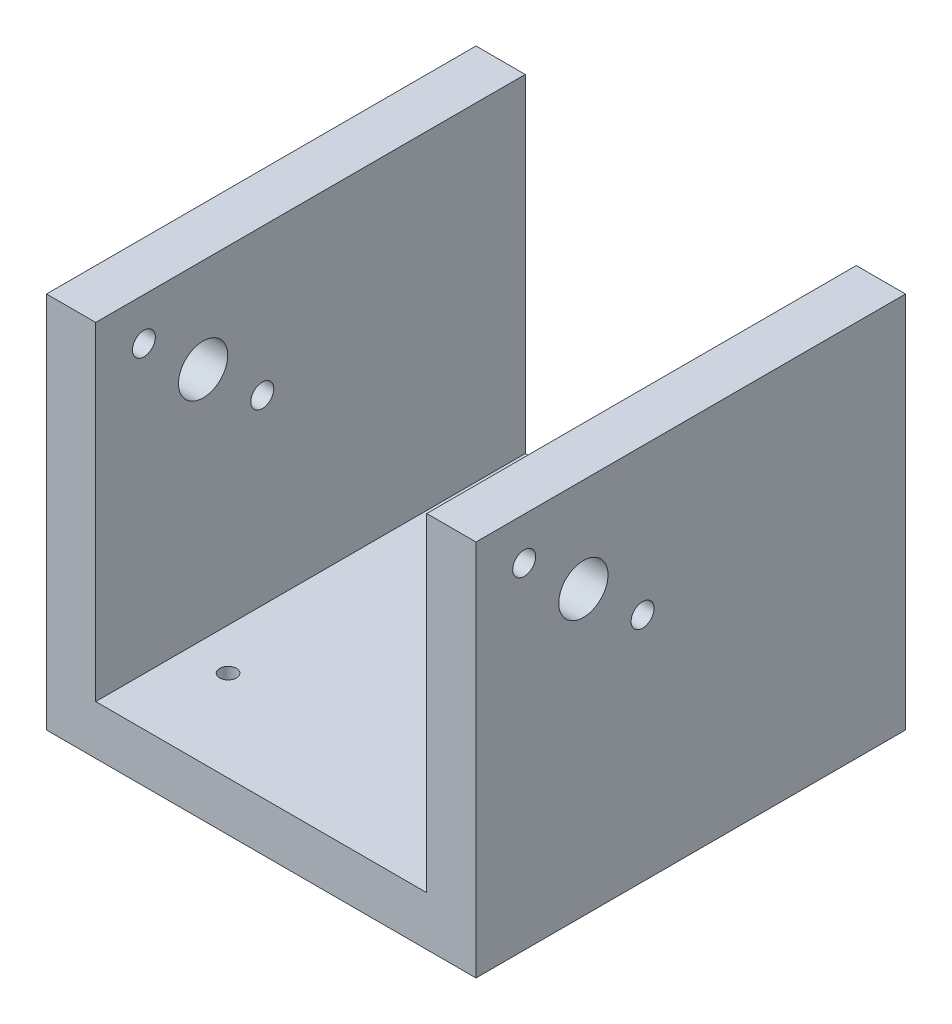
ISO-10303-21;
HEADER;
FILE_DESCRIPTION(('STEP AP214'),'2;1');
FILE_NAME('part.step','',(''),(''),'','','');
FILE_SCHEMA(('AUTOMOTIVE_DESIGN { 1 0 10303 214 1 1 1 1 }'));
ENDSEC;
DATA;
#1=APPLICATION_CONTEXT('core data for automotive mechanical design processes');
#2=APPLICATION_PROTOCOL_DEFINITION('international standard','automotive_design',2000,#1);
#3=PRODUCT_CONTEXT('',#1,'mechanical');
#4=PRODUCT('Part','Part','',(#3));
#5=PRODUCT_RELATED_PRODUCT_CATEGORY('part','',(#4));
#6=PRODUCT_DEFINITION_FORMATION('','',#4);
#7=PRODUCT_DEFINITION_CONTEXT('part definition',#1,'design');
#8=PRODUCT_DEFINITION('design','',#6,#7);
#9=PRODUCT_DEFINITION_SHAPE('','',#8);
#10=(LENGTH_UNIT() NAMED_UNIT(*) SI_UNIT(.MILLI.,.METRE.));
#11=(NAMED_UNIT(*) PLANE_ANGLE_UNIT() SI_UNIT($,.RADIAN.));
#12=(NAMED_UNIT(*) SI_UNIT($,.STERADIAN.) SOLID_ANGLE_UNIT());
#13=UNCERTAINTY_MEASURE_WITH_UNIT(LENGTH_MEASURE(1.E-05),#10,'distance_accuracy_value','');
#14=(GEOMETRIC_REPRESENTATION_CONTEXT(3) GLOBAL_UNCERTAINTY_ASSIGNED_CONTEXT((#13)) GLOBAL_UNIT_ASSIGNED_CONTEXT((#10,
#11,#12)) REPRESENTATION_CONTEXT('',''));
#15=CARTESIAN_POINT('',(0.,0.,0.));
#16=DIRECTION('',(0.,0.,1.));
#17=DIRECTION('',(1.,0.,0.));
#18=AXIS2_PLACEMENT_3D('',#15,#16,#17);
#19=CARTESIAN_POINT('',(0.,15.,0.));
#20=DIRECTION('',(0.,1.,0.));
#21=DIRECTION('',(0.,0.,1.));
#22=AXIS2_PLACEMENT_3D('',#19,#20,#21);
#23=PLANE('',#22);
#24=DIRECTION('',(0.,0.,1.));
#25=VECTOR('',#24,1.);
#26=CARTESIAN_POINT('',(-50.4073772597556,15.,0.));
#27=LINE('',#26,#25);
#28=CARTESIAN_POINT('',(-50.4073772597556,15.,-65.4073772597556));
#29=VERTEX_POINT('',#28);
#30=CARTESIAN_POINT('',(-50.4073772597556,15.,65.4073772597556));
#31=VERTEX_POINT('',#30);
#32=EDGE_CURVE('E117',#29,#31,#27,.T.);
#33=ORIENTED_EDGE('',*,*,#32,.T.);
#34=DIRECTION('',(1.,0.,0.));
#35=VECTOR('',#34,1.);
#36=CARTESIAN_POINT('',(65.4073772597556,15.,65.4073772597556));
#37=LINE('',#36,#35);
#38=CARTESIAN_POINT('',(50.4073772597556,15.,65.4073772597556));
#39=VERTEX_POINT('',#38);
#40=EDGE_CURVE('E186',#31,#39,#37,.T.);
#41=ORIENTED_EDGE('',*,*,#40,.T.);
#42=DIRECTION('',(0.,0.,-1.));
#43=VECTOR('',#42,1.);
#44=CARTESIAN_POINT('',(50.4073772597556,15.,0.));
#45=LINE('',#44,#43);
#46=CARTESIAN_POINT('',(50.4073772597556,15.,-65.4073772597556));
#47=VERTEX_POINT('',#46);
#48=EDGE_CURVE('E119',#39,#47,#45,.T.);
#49=ORIENTED_EDGE('',*,*,#48,.T.);
#50=DIRECTION('',(-1.,0.,0.));
#51=VECTOR('',#50,1.);
#52=CARTESIAN_POINT('',(35.4073772597556,15.,-65.4073772597556));
#53=LINE('',#52,#51);
#54=EDGE_CURVE('E58',#47,#29,#53,.T.);
#55=ORIENTED_EDGE('',*,*,#54,.T.);
#56=EDGE_LOOP('',(#33,#41,#49,#55));
#57=FACE_BOUND('',#56,.T.);
#58=CARTESIAN_POINT('',(-37.7595021153596,15.,37.7595021153637));
#59=DIRECTION('',(0.,1.,0.));
#60=DIRECTION('',(0.,0.,1.));
#61=AXIS2_PLACEMENT_3D('',#58,#59,#60);
#62=CIRCLE('',#61,2.55000000000154);
#63=CARTESIAN_POINT('',(-37.7595021153596,15.,40.3095021153653));
#64=VERTEX_POINT('',#63);
#65=EDGE_CURVE('E168',#64,#64,#62,.T.);
#66=ORIENTED_EDGE('',*,*,#65,.F.);
#67=EDGE_LOOP('',(#66));
#68=FACE_BOUND('',#67,.T.);
#69=CARTESIAN_POINT('',(37.7595021153616,15.,-37.7595021153616));
#70=DIRECTION('',(0.,1.,0.));
#71=DIRECTION('',(0.,0.,1.));
#72=AXIS2_PLACEMENT_3D('',#69,#70,#71);
#73=CIRCLE('',#72,2.55);
#74=CARTESIAN_POINT('',(37.7595021153616,15.,-35.2095021153616));
#75=VERTEX_POINT('',#74);
#76=EDGE_CURVE('E180',#75,#75,#73,.T.);
#77=ORIENTED_EDGE('',*,*,#76,.F.);
#78=EDGE_LOOP('',(#77));
#79=FACE_BOUND('',#78,.T.);
#80=CARTESIAN_POINT('',(37.7595021153637,15.,37.7595021153616));
#81=DIRECTION('',(0.,1.,0.));
#82=DIRECTION('',(0.,0.,1.));
#83=AXIS2_PLACEMENT_3D('',#80,#81,#82);
#84=CIRCLE('',#83,2.54999999999946);
#85=CARTESIAN_POINT('',(37.7595021153637,15.,40.3095021153611));
#86=VERTEX_POINT('',#85);
#87=EDGE_CURVE('E174',#86,#86,#84,.T.);
#88=ORIENTED_EDGE('',*,*,#87,.F.);
#89=EDGE_LOOP('',(#88));
#90=FACE_BOUND('',#89,.T.);
#91=CARTESIAN_POINT('',(-37.7595021153616,15.,-37.7595021153595));
#92=DIRECTION('',(0.,1.,0.));
#93=DIRECTION('',(0.,0.,1.));
#94=AXIS2_PLACEMENT_3D('',#91,#92,#93);
#95=CIRCLE('',#94,2.55000000000225);
#96=CARTESIAN_POINT('',(-37.7595021153616,15.,-35.2095021153573));
#97=VERTEX_POINT('',#96);
#98=EDGE_CURVE('E162',#97,#97,#95,.T.);
#99=ORIENTED_EDGE('',*,*,#98,.F.);
#100=EDGE_LOOP('',(#99));
#101=FACE_BOUND('',#100,.T.);
#102=ADVANCED_FACE('F41',(#57,#68,#79,#90,#101),#23,.T.);
#103=CARTESIAN_POINT('',(0.,0.,0.));
#104=DIRECTION('',(0.,1.,0.));
#105=DIRECTION('',(0.,0.,1.));
#106=AXIS2_PLACEMENT_3D('',#103,#104,#105);
#107=PLANE('',#106);
#108=DIRECTION('',(0.,0.,-1.));
#109=VECTOR('',#108,1.);
#110=CARTESIAN_POINT('',(65.4073772597556,0.,-65.4073772597556));
#111=LINE('',#110,#109);
#112=CARTESIAN_POINT('',(65.4073772597556,0.,65.4073772597556));
#113=VERTEX_POINT('',#112);
#114=CARTESIAN_POINT('',(65.4073772597556,0.,-65.4073772597556));
#115=VERTEX_POINT('',#114);
#116=EDGE_CURVE('E183',#113,#115,#111,.T.);
#117=ORIENTED_EDGE('',*,*,#116,.F.);
#118=DIRECTION('',(1.,0.,0.));
#119=VECTOR('',#118,1.);
#120=CARTESIAN_POINT('',(-35.4073772597556,0.,65.4073772597556));
#121=LINE('',#120,#119);
#122=CARTESIAN_POINT('',(-65.4073772597556,0.,65.4073772597556));
#123=VERTEX_POINT('',#122);
#124=EDGE_CURVE('E188',#123,#113,#121,.T.);
#125=ORIENTED_EDGE('',*,*,#124,.F.);
#126=DIRECTION('',(0.,0.,1.));
#127=VECTOR('',#126,1.);
#128=CARTESIAN_POINT('',(-65.4073772597557,0.,35.4073772597556));
#129=LINE('',#128,#127);
#130=CARTESIAN_POINT('',(-65.4073772597556,0.,-65.4073772597556));
#131=VERTEX_POINT('',#130);
#132=EDGE_CURVE('E195',#131,#123,#129,.T.);
#133=ORIENTED_EDGE('',*,*,#132,.F.);
#134=DIRECTION('',(-1.,0.,0.));
#135=VECTOR('',#134,1.);
#136=CARTESIAN_POINT('',(-65.4073772597556,0.,-65.4073772597556));
#137=LINE('',#136,#135);
#138=EDGE_CURVE('E193',#115,#131,#137,.T.);
#139=ORIENTED_EDGE('',*,*,#138,.F.);
#140=EDGE_LOOP('',(#117,#125,#133,#139));
#141=FACE_BOUND('',#140,.T.);
#142=CARTESIAN_POINT('',(37.7595021153616,0.,-37.7595021153616));
#143=DIRECTION('',(0.,1.,0.));
#144=DIRECTION('',(0.,0.,1.));
#145=AXIS2_PLACEMENT_3D('',#142,#143,#144);
#146=CIRCLE('',#145,2.55);
#147=CARTESIAN_POINT('',(37.7595021153616,0.,-35.2095021153616));
#148=VERTEX_POINT('',#147);
#149=EDGE_CURVE('E177',#148,#148,#146,.T.);
#150=ORIENTED_EDGE('',*,*,#149,.T.);
#151=EDGE_LOOP('',(#150));
#152=FACE_BOUND('',#151,.T.);
#153=CARTESIAN_POINT('',(37.7595021153637,0.,37.7595021153616));
#154=DIRECTION('',(0.,1.,0.));
#155=DIRECTION('',(0.,0.,1.));
#156=AXIS2_PLACEMENT_3D('',#153,#154,#155);
#157=CIRCLE('',#156,2.54999999999946);
#158=CARTESIAN_POINT('',(37.7595021153637,0.,40.3095021153611));
#159=VERTEX_POINT('',#158);
#160=EDGE_CURVE('E171',#159,#159,#157,.T.);
#161=ORIENTED_EDGE('',*,*,#160,.T.);
#162=EDGE_LOOP('',(#161));
#163=FACE_BOUND('',#162,.T.);
#164=CARTESIAN_POINT('',(-37.7595021153596,0.,37.7595021153637));
#165=DIRECTION('',(0.,1.,0.));
#166=DIRECTION('',(0.,0.,1.));
#167=AXIS2_PLACEMENT_3D('',#164,#165,#166);
#168=CIRCLE('',#167,2.55000000000154);
#169=CARTESIAN_POINT('',(-37.7595021153596,0.,40.3095021153653));
#170=VERTEX_POINT('',#169);
#171=EDGE_CURVE('E165',#170,#170,#168,.T.);
#172=ORIENTED_EDGE('',*,*,#171,.T.);
#173=EDGE_LOOP('',(#172));
#174=FACE_BOUND('',#173,.T.);
#175=CARTESIAN_POINT('',(-37.7595021153616,0.,-37.7595021153595));
#176=DIRECTION('',(0.,1.,0.));
#177=DIRECTION('',(0.,0.,1.));
#178=AXIS2_PLACEMENT_3D('',#175,#176,#177);
#179=CIRCLE('',#178,2.55000000000225);
#180=CARTESIAN_POINT('',(-37.7595021153616,0.,-35.2095021153573));
#181=VERTEX_POINT('',#180);
#182=EDGE_CURVE('E161',#181,#181,#179,.T.);
#183=ORIENTED_EDGE('',*,*,#182,.T.);
#184=EDGE_LOOP('',(#183));
#185=FACE_BOUND('',#184,.T.);
#186=ADVANCED_FACE('F253',(#141,#152,#163,#174,#185),#107,.F.);
#187=CARTESIAN_POINT('',(65.4073772597556,15.,-65.4073772597556));
#188=DIRECTION('',(-1.,0.,0.));
#189=DIRECTION('',(0.,0.,1.));
#190=AXIS2_PLACEMENT_3D('',#187,#188,#189);
#191=PLANE('',#190);
#192=CARTESIAN_POINT('',(65.4073772597556,102.095983063023,50.7288050169189));
#193=DIRECTION('',(-1.,0.,0.));
#194=DIRECTION('',(0.,0.,1.));
#195=AXIS2_PLACEMENT_3D('',#192,#193,#194);
#196=CIRCLE('',#195,3.5);
#197=CARTESIAN_POINT('',(65.4073772597556,102.095983063023,54.2288050169189));
#198=VERTEX_POINT('',#197);
#199=EDGE_CURVE('E226',#198,#198,#196,.F.);
#200=ORIENTED_EDGE('',*,*,#199,.F.);
#201=EDGE_LOOP('',(#200));
#202=FACE_BOUND('',#201,.T.);
#203=CARTESIAN_POINT('',(65.4073772597556,70.4040169369767,14.6785722428367));
#204=DIRECTION('',(-1.,0.,0.));
#205=DIRECTION('',(0.,0.,1.));
#206=AXIS2_PLACEMENT_3D('',#203,#204,#205);
#207=CIRCLE('',#206,3.5);
#208=CARTESIAN_POINT('',(65.4073772597556,70.4040169369767,18.1785722428367));
#209=VERTEX_POINT('',#208);
#210=EDGE_CURVE('E225',#209,#209,#207,.F.);
#211=ORIENTED_EDGE('',*,*,#210,.F.);
#212=EDGE_LOOP('',(#211));
#213=FACE_BOUND('',#212,.T.);
#214=CARTESIAN_POINT('',(65.4073772597556,86.25,32.7036886298778));
#215=DIRECTION('',(-1.,0.,0.));
#216=DIRECTION('',(0.,0.,1.));
#217=AXIS2_PLACEMENT_3D('',#214,#215,#216);
#218=CIRCLE('',#217,7.5);
#219=CARTESIAN_POINT('',(65.4073772597556,86.25,40.2036886298778));
#220=VERTEX_POINT('',#219);
#221=EDGE_CURVE('E208',#220,#220,#218,.F.);
#222=ORIENTED_EDGE('',*,*,#221,.F.);
#223=EDGE_LOOP('',(#222));
#224=FACE_BOUND('',#223,.T.);
#225=ORIENTED_EDGE('',*,*,#116,.T.);
#226=DIRECTION('',(0.,-1.,0.));
#227=VECTOR('',#226,1.);
#228=CARTESIAN_POINT('',(65.4073772597556,15.,-65.4073772597556));
#229=LINE('',#228,#227);
#230=CARTESIAN_POINT('',(65.4073772597556,115.,-65.4073772597556));
#231=VERTEX_POINT('',#230);
#232=EDGE_CURVE('E50',#231,#115,#229,.T.);
#233=ORIENTED_EDGE('',*,*,#232,.F.);
#234=DIRECTION('',(0.,0.,-1.));
#235=VECTOR('',#234,1.);
#236=CARTESIAN_POINT('',(65.4073772597556,115.,0.));
#237=LINE('',#236,#235);
#238=CARTESIAN_POINT('',(65.4073772597556,115.,65.4073772597556));
#239=VERTEX_POINT('',#238);
#240=EDGE_CURVE('E151',#239,#231,#237,.T.);
#241=ORIENTED_EDGE('',*,*,#240,.F.);
#242=DIRECTION('',(0.,-1.,0.));
#243=VECTOR('',#242,1.);
#244=CARTESIAN_POINT('',(65.4073772597556,15.,65.4073772597556));
#245=LINE('',#244,#243);
#246=EDGE_CURVE('E11',#239,#113,#245,.T.);
#247=ORIENTED_EDGE('',*,*,#246,.T.);
#248=EDGE_LOOP('',(#225,#233,#241,#247));
#249=FACE_BOUND('',#248,.T.);
#250=ADVANCED_FACE('F43',(#202,#213,#224,#249),#191,.F.);
#251=CARTESIAN_POINT('',(-65.4073772597556,15.,-65.4073772597556));
#252=DIRECTION('',(0.,0.,1.));
#253=DIRECTION('',(1.,0.,0.));
#254=AXIS2_PLACEMENT_3D('',#251,#252,#253);
#255=PLANE('',#254);
#256=ORIENTED_EDGE('',*,*,#138,.T.);
#257=DIRECTION('',(0.,-1.,0.));
#258=VECTOR('',#257,1.);
#259=CARTESIAN_POINT('',(-65.4073772597556,15.,-65.4073772597556));
#260=LINE('',#259,#258);
#261=CARTESIAN_POINT('',(-65.4073772597556,115.,-65.4073772597556));
#262=VERTEX_POINT('',#261);
#263=EDGE_CURVE('E127',#262,#131,#260,.T.);
#264=ORIENTED_EDGE('',*,*,#263,.F.);
#265=DIRECTION('',(-1.,0.,0.));
#266=VECTOR('',#265,1.);
#267=CARTESIAN_POINT('',(0.,115.,-65.4073772597556));
#268=LINE('',#267,#266);
#269=CARTESIAN_POINT('',(-50.4073772597556,115.,-65.4073772597556));
#270=VERTEX_POINT('',#269);
#271=EDGE_CURVE('E123',#270,#262,#268,.T.);
#272=ORIENTED_EDGE('',*,*,#271,.F.);
#273=DIRECTION('',(0.,-1.,0.));
#274=VECTOR('',#273,1.);
#275=CARTESIAN_POINT('',(-50.4073772597556,115.,-65.4073772597556));
#276=LINE('',#275,#274);
#277=EDGE_CURVE('E111',#270,#29,#276,.T.);
#278=ORIENTED_EDGE('',*,*,#277,.T.);
#279=ORIENTED_EDGE('',*,*,#54,.F.);
#280=DIRECTION('',(0.,-1.,0.));
#281=VECTOR('',#280,1.);
#282=CARTESIAN_POINT('',(50.4073772597556,115.,-65.4073772597556));
#283=LINE('',#282,#281);
#284=CARTESIAN_POINT('',(50.4073772597556,115.,-65.4073772597556));
#285=VERTEX_POINT('',#284);
#286=EDGE_CURVE('E66',#285,#47,#283,.T.);
#287=ORIENTED_EDGE('',*,*,#286,.F.);
#288=DIRECTION('',(-1.,0.,0.));
#289=VECTOR('',#288,1.);
#290=CARTESIAN_POINT('',(0.,115.,-65.4073772597556));
#291=LINE('',#290,#289);
#292=EDGE_CURVE('E154',#231,#285,#291,.T.);
#293=ORIENTED_EDGE('',*,*,#292,.F.);
#294=ORIENTED_EDGE('',*,*,#232,.T.);
#295=EDGE_LOOP('',(#256,#264,#272,#278,#279,#287,#293,#294));
#296=FACE_BOUND('',#295,.T.);
#297=ADVANCED_FACE('F125',(#296),#255,.F.);
#298=CARTESIAN_POINT('',(-65.4073772597557,15.,35.4073772597556));
#299=DIRECTION('',(1.,0.,0.));
#300=DIRECTION('',(0.,0.,-1.));
#301=AXIS2_PLACEMENT_3D('',#298,#299,#300);
#302=PLANE('',#301);
#303=CARTESIAN_POINT('',(-65.4073772597556,102.095983063023,50.7288050169189));
#304=DIRECTION('',(-1.,0.,0.));
#305=DIRECTION('',(0.,0.,1.));
#306=AXIS2_PLACEMENT_3D('',#303,#304,#305);
#307=CIRCLE('',#306,3.5);
#308=CARTESIAN_POINT('',(-65.4073772597556,102.095983063023,54.2288050169189));
#309=VERTEX_POINT('',#308);
#310=EDGE_CURVE('E230',#309,#309,#307,.T.);
#311=ORIENTED_EDGE('',*,*,#310,.F.);
#312=EDGE_LOOP('',(#311));
#313=FACE_BOUND('',#312,.T.);
#314=CARTESIAN_POINT('',(-65.4073772597557,70.4040169369767,14.6785722428367));
#315=DIRECTION('',(-1.,0.,0.));
#316=DIRECTION('',(0.,0.,1.));
#317=AXIS2_PLACEMENT_3D('',#314,#315,#316);
#318=CIRCLE('',#317,3.5);
#319=CARTESIAN_POINT('',(-65.4073772597557,70.4040169369767,18.1785722428367));
#320=VERTEX_POINT('',#319);
#321=EDGE_CURVE('E229',#320,#320,#318,.T.);
#322=ORIENTED_EDGE('',*,*,#321,.F.);
#323=EDGE_LOOP('',(#322));
#324=FACE_BOUND('',#323,.T.);
#325=CARTESIAN_POINT('',(-65.4073772597557,86.25,32.7036886298778));
#326=DIRECTION('',(-1.,0.,0.));
#327=DIRECTION('',(0.,0.,1.));
#328=AXIS2_PLACEMENT_3D('',#325,#326,#327);
#329=CIRCLE('',#328,7.5);
#330=CARTESIAN_POINT('',(-65.4073772597557,86.25,40.2036886298778));
#331=VERTEX_POINT('',#330);
#332=EDGE_CURVE('E222',#331,#331,#329,.T.);
#333=ORIENTED_EDGE('',*,*,#332,.F.);
#334=EDGE_LOOP('',(#333));
#335=FACE_BOUND('',#334,.T.);
#336=ORIENTED_EDGE('',*,*,#132,.T.);
#337=DIRECTION('',(0.,-1.,0.));
#338=VECTOR('',#337,1.);
#339=CARTESIAN_POINT('',(-65.4073772597556,15.,65.4073772597556));
#340=LINE('',#339,#338);
#341=CARTESIAN_POINT('',(-65.4073772597557,115.,65.4073772597556));
#342=VERTEX_POINT('',#341);
#343=EDGE_CURVE('E190',#342,#123,#340,.T.);
#344=ORIENTED_EDGE('',*,*,#343,.F.);
#345=DIRECTION('',(0.,0.,1.));
#346=VECTOR('',#345,1.);
#347=CARTESIAN_POINT('',(-65.4073772597557,115.,0.));
#348=LINE('',#347,#346);
#349=EDGE_CURVE('E131',#262,#342,#348,.T.);
#350=ORIENTED_EDGE('',*,*,#349,.F.);
#351=ORIENTED_EDGE('',*,*,#263,.T.);
#352=EDGE_LOOP('',(#336,#344,#350,#351));
#353=FACE_BOUND('',#352,.T.);
#354=ADVANCED_FACE('F240',(#313,#324,#335,#353),#302,.F.);
#355=CARTESIAN_POINT('',(-35.4073772597556,15.,65.4073772597556));
#356=DIRECTION('',(0.,0.,-1.));
#357=DIRECTION('',(-1.,0.,0.));
#358=AXIS2_PLACEMENT_3D('',#355,#356,#357);
#359=PLANE('',#358);
#360=ORIENTED_EDGE('',*,*,#124,.T.);
#361=ORIENTED_EDGE('',*,*,#246,.F.);
#362=DIRECTION('',(1.,0.,0.));
#363=VECTOR('',#362,1.);
#364=CARTESIAN_POINT('',(0.,115.,65.4073772597556));
#365=LINE('',#364,#363);
#366=CARTESIAN_POINT('',(50.4073772597556,115.,65.4073772597556));
#367=VERTEX_POINT('',#366);
#368=EDGE_CURVE('E148',#367,#239,#365,.T.);
#369=ORIENTED_EDGE('',*,*,#368,.F.);
#370=DIRECTION('',(0.,-1.,0.));
#371=VECTOR('',#370,1.);
#372=CARTESIAN_POINT('',(50.4073772597556,115.,65.4073772597556));
#373=LINE('',#372,#371);
#374=EDGE_CURVE('E158',#367,#39,#373,.T.);
#375=ORIENTED_EDGE('',*,*,#374,.T.);
#376=ORIENTED_EDGE('',*,*,#40,.F.);
#377=DIRECTION('',(0.,-1.,0.));
#378=VECTOR('',#377,1.);
#379=CARTESIAN_POINT('',(-50.4073772597556,115.,65.4073772597556));
#380=LINE('',#379,#378);
#381=CARTESIAN_POINT('',(-50.4073772597556,115.,65.4073772597556));
#382=VERTEX_POINT('',#381);
#383=EDGE_CURVE('E120',#382,#31,#380,.T.);
#384=ORIENTED_EDGE('',*,*,#383,.F.);
#385=DIRECTION('',(1.,0.,0.));
#386=VECTOR('',#385,1.);
#387=CARTESIAN_POINT('',(0.,115.,65.4073772597556));
#388=LINE('',#387,#386);
#389=EDGE_CURVE('E135',#342,#382,#388,.T.);
#390=ORIENTED_EDGE('',*,*,#389,.F.);
#391=ORIENTED_EDGE('',*,*,#343,.T.);
#392=EDGE_LOOP('',(#360,#361,#369,#375,#376,#384,#390,#391));
#393=FACE_BOUND('',#392,.T.);
#394=ADVANCED_FACE('F243',(#393),#359,.F.);
#395=CARTESIAN_POINT('',(37.7595021153616,15.,-37.7595021153616));
#396=DIRECTION('',(0.,-1.,0.));
#397=DIRECTION('',(0.,0.,-1.));
#398=AXIS2_PLACEMENT_3D('',#395,#396,#397);
#399=CYLINDRICAL_SURFACE('',#398,2.55);
#400=ORIENTED_EDGE('',*,*,#76,.T.);
#401=EDGE_LOOP('',(#400));
#402=FACE_BOUND('',#401,.T.);
#403=ORIENTED_EDGE('',*,*,#149,.F.);
#404=EDGE_LOOP('',(#403));
#405=FACE_BOUND('',#404,.T.);
#406=ADVANCED_FACE('F281',(#402,#405),#399,.F.);
#407=CARTESIAN_POINT('',(37.7595021153637,15.,37.7595021153616));
#408=DIRECTION('',(0.,-1.,0.));
#409=DIRECTION('',(0.,0.,-1.));
#410=AXIS2_PLACEMENT_3D('',#407,#408,#409);
#411=CYLINDRICAL_SURFACE('',#410,2.54999999999946);
#412=ORIENTED_EDGE('',*,*,#87,.T.);
#413=EDGE_LOOP('',(#412));
#414=FACE_BOUND('',#413,.T.);
#415=ORIENTED_EDGE('',*,*,#160,.F.);
#416=EDGE_LOOP('',(#415));
#417=FACE_BOUND('',#416,.T.);
#418=ADVANCED_FACE('F304',(#414,#417),#411,.F.);
#419=CARTESIAN_POINT('',(-37.7595021153596,15.,37.7595021153637));
#420=DIRECTION('',(0.,-1.,0.));
#421=DIRECTION('',(0.,0.,-1.));
#422=AXIS2_PLACEMENT_3D('',#419,#420,#421);
#423=CYLINDRICAL_SURFACE('',#422,2.55000000000154);
#424=ORIENTED_EDGE('',*,*,#65,.T.);
#425=EDGE_LOOP('',(#424));
#426=FACE_BOUND('',#425,.T.);
#427=ORIENTED_EDGE('',*,*,#171,.F.);
#428=EDGE_LOOP('',(#427));
#429=FACE_BOUND('',#428,.T.);
#430=ADVANCED_FACE('F267',(#426,#429),#423,.F.);
#431=CARTESIAN_POINT('',(-37.7595021153616,15.,-37.7595021153595));
#432=DIRECTION('',(0.,-1.,0.));
#433=DIRECTION('',(0.,0.,-1.));
#434=AXIS2_PLACEMENT_3D('',#431,#432,#433);
#435=CYLINDRICAL_SURFACE('',#434,2.55000000000225);
#436=ORIENTED_EDGE('',*,*,#98,.T.);
#437=EDGE_LOOP('',(#436));
#438=FACE_BOUND('',#437,.T.);
#439=ORIENTED_EDGE('',*,*,#182,.F.);
#440=EDGE_LOOP('',(#439));
#441=FACE_BOUND('',#440,.T.);
#442=ADVANCED_FACE('F263',(#438,#441),#435,.F.);
#443=CARTESIAN_POINT('',(50.4073772597556,115.,0.));
#444=DIRECTION('',(-1.,0.,0.));
#445=DIRECTION('',(0.,0.,1.));
#446=AXIS2_PLACEMENT_3D('',#443,#444,#445);
#447=PLANE('',#446);
#448=CARTESIAN_POINT('',(50.4073772597556,102.095983063023,50.7288050169189));
#449=DIRECTION('',(-1.,0.,0.));
#450=DIRECTION('',(0.,0.,1.));
#451=AXIS2_PLACEMENT_3D('',#448,#449,#450);
#452=CIRCLE('',#451,3.5);
#453=CARTESIAN_POINT('',(50.4073772597556,102.095983063023,54.2288050169189));
#454=VERTEX_POINT('',#453);
#455=EDGE_CURVE('E138',#454,#454,#452,.T.);
#456=ORIENTED_EDGE('',*,*,#455,.F.);
#457=EDGE_LOOP('',(#456));
#458=FACE_BOUND('',#457,.T.);
#459=CARTESIAN_POINT('',(50.4073772597556,70.4040169369767,14.6785722428367));
#460=DIRECTION('',(-1.,0.,0.));
#461=DIRECTION('',(0.,0.,1.));
#462=AXIS2_PLACEMENT_3D('',#459,#460,#461);
#463=CIRCLE('',#462,3.5);
#464=CARTESIAN_POINT('',(50.4073772597556,70.4040169369767,18.1785722428367));
#465=VERTEX_POINT('',#464);
#466=EDGE_CURVE('E211',#465,#465,#463,.T.);
#467=ORIENTED_EDGE('',*,*,#466,.F.);
#468=EDGE_LOOP('',(#467));
#469=FACE_BOUND('',#468,.T.);
#470=CARTESIAN_POINT('',(50.4073772597556,86.25,32.7036886298778));
#471=DIRECTION('',(-1.,0.,0.));
#472=DIRECTION('',(0.,0.,1.));
#473=AXIS2_PLACEMENT_3D('',#470,#471,#472);
#474=CIRCLE('',#473,7.5);
#475=CARTESIAN_POINT('',(50.4073772597556,86.25,40.2036886298778));
#476=VERTEX_POINT('',#475);
#477=EDGE_CURVE('E207',#476,#476,#474,.T.);
#478=ORIENTED_EDGE('',*,*,#477,.F.);
#479=EDGE_LOOP('',(#478));
#480=FACE_BOUND('',#479,.T.);
#481=ORIENTED_EDGE('',*,*,#48,.F.);
#482=ORIENTED_EDGE('',*,*,#374,.F.);
#483=DIRECTION('',(0.,0.,-1.));
#484=VECTOR('',#483,1.);
#485=CARTESIAN_POINT('',(50.4073772597556,115.,0.));
#486=LINE('',#485,#484);
#487=EDGE_CURVE('E146',#367,#285,#486,.T.);
#488=ORIENTED_EDGE('',*,*,#487,.T.);
#489=ORIENTED_EDGE('',*,*,#286,.T.);
#490=EDGE_LOOP('',(#481,#482,#488,#489));
#491=FACE_BOUND('',#490,.T.);
#492=ADVANCED_FACE('F266',(#458,#469,#480,#491),#447,.T.);
#493=CARTESIAN_POINT('',(0.,115.,0.));
#494=DIRECTION('',(0.,1.,0.));
#495=DIRECTION('',(0.,0.,1.));
#496=AXIS2_PLACEMENT_3D('',#493,#494,#495);
#497=PLANE('',#496);
#498=ORIENTED_EDGE('',*,*,#487,.F.);
#499=ORIENTED_EDGE('',*,*,#368,.T.);
#500=ORIENTED_EDGE('',*,*,#240,.T.);
#501=ORIENTED_EDGE('',*,*,#292,.T.);
#502=EDGE_LOOP('',(#498,#499,#500,#501));
#503=FACE_BOUND('',#502,.T.);
#504=ADVANCED_FACE('F328',(#503),#497,.T.);
#505=CARTESIAN_POINT('',(-50.4073772597556,115.,0.));
#506=DIRECTION('',(1.,0.,0.));
#507=DIRECTION('',(0.,0.,-1.));
#508=AXIS2_PLACEMENT_3D('',#505,#506,#507);
#509=PLANE('',#508);
#510=CARTESIAN_POINT('',(-50.4073772597556,102.095983063023,50.7288050169189));
#511=DIRECTION('',(1.,0.,0.));
#512=DIRECTION('',(0.,0.,-1.));
#513=AXIS2_PLACEMENT_3D('',#510,#511,#512);
#514=CIRCLE('',#513,3.5);
#515=CARTESIAN_POINT('',(-50.4073772597556,102.095983063023,47.2288050169189));
#516=VERTEX_POINT('',#515);
#517=EDGE_CURVE('E45',#516,#516,#514,.T.);
#518=ORIENTED_EDGE('',*,*,#517,.F.);
#519=EDGE_LOOP('',(#518));
#520=FACE_BOUND('',#519,.T.);
#521=CARTESIAN_POINT('',(-50.4073772597557,70.4040169369767,14.6785722428367));
#522=DIRECTION('',(1.,0.,0.));
#523=DIRECTION('',(0.,0.,-1.));
#524=AXIS2_PLACEMENT_3D('',#521,#522,#523);
#525=CIRCLE('',#524,3.5);
#526=CARTESIAN_POINT('',(-50.4073772597557,70.4040169369767,11.1785722428367));
#527=VERTEX_POINT('',#526);
#528=EDGE_CURVE('E209',#527,#527,#525,.T.);
#529=ORIENTED_EDGE('',*,*,#528,.F.);
#530=EDGE_LOOP('',(#529));
#531=FACE_BOUND('',#530,.T.);
#532=CARTESIAN_POINT('',(-50.4073772597556,86.25,32.7036886298778));
#533=DIRECTION('',(1.,0.,0.));
#534=DIRECTION('',(0.,0.,-1.));
#535=AXIS2_PLACEMENT_3D('',#532,#533,#534);
#536=CIRCLE('',#535,7.5);
#537=CARTESIAN_POINT('',(-50.4073772597556,86.25,25.2036886298778));
#538=VERTEX_POINT('',#537);
#539=EDGE_CURVE('E205',#538,#538,#536,.T.);
#540=ORIENTED_EDGE('',*,*,#539,.F.);
#541=EDGE_LOOP('',(#540));
#542=FACE_BOUND('',#541,.T.);
#543=ORIENTED_EDGE('',*,*,#32,.F.);
#544=ORIENTED_EDGE('',*,*,#277,.F.);
#545=DIRECTION('',(0.,0.,1.));
#546=VECTOR('',#545,1.);
#547=CARTESIAN_POINT('',(-50.4073772597556,115.,0.));
#548=LINE('',#547,#546);
#549=EDGE_CURVE('E116',#270,#382,#548,.T.);
#550=ORIENTED_EDGE('',*,*,#549,.T.);
#551=ORIENTED_EDGE('',*,*,#383,.T.);
#552=EDGE_LOOP('',(#543,#544,#550,#551));
#553=FACE_BOUND('',#552,.T.);
#554=ADVANCED_FACE('F113',(#520,#531,#542,#553),#509,.T.);
#555=CARTESIAN_POINT('',(0.,115.,0.));
#556=DIRECTION('',(0.,1.,0.));
#557=DIRECTION('',(0.,0.,1.));
#558=AXIS2_PLACEMENT_3D('',#555,#556,#557);
#559=PLANE('',#558);
#560=ORIENTED_EDGE('',*,*,#549,.F.);
#561=ORIENTED_EDGE('',*,*,#271,.T.);
#562=ORIENTED_EDGE('',*,*,#349,.T.);
#563=ORIENTED_EDGE('',*,*,#389,.T.);
#564=EDGE_LOOP('',(#560,#561,#562,#563));
#565=FACE_BOUND('',#564,.T.);
#566=ADVANCED_FACE('F133',(#565),#559,.T.);
#567=CARTESIAN_POINT('',(86.6205806953521,86.25,32.7036886298778));
#568=DIRECTION('',(-1.,0.,0.));
#569=DIRECTION('',(0.,0.,1.));
#570=AXIS2_PLACEMENT_3D('',#567,#568,#569);
#571=CYLINDRICAL_SURFACE('',#570,7.5);
#572=ORIENTED_EDGE('',*,*,#539,.T.);
#573=EDGE_LOOP('',(#572));
#574=FACE_BOUND('',#573,.T.);
#575=ORIENTED_EDGE('',*,*,#332,.T.);
#576=EDGE_LOOP('',(#575));
#577=FACE_BOUND('',#576,.T.);
#578=ADVANCED_FACE('F350',(#574,#577),#571,.F.);
#579=CARTESIAN_POINT('',(86.6205806953521,70.4040169369767,14.6785722428367));
#580=DIRECTION('',(-1.,0.,0.));
#581=DIRECTION('',(0.,0.,1.));
#582=AXIS2_PLACEMENT_3D('',#579,#580,#581);
#583=CYLINDRICAL_SURFACE('',#582,3.5);
#584=ORIENTED_EDGE('',*,*,#528,.T.);
#585=EDGE_LOOP('',(#584));
#586=FACE_BOUND('',#585,.T.);
#587=ORIENTED_EDGE('',*,*,#321,.T.);
#588=EDGE_LOOP('',(#587));
#589=FACE_BOUND('',#588,.T.);
#590=ADVANCED_FACE('F238',(#586,#589),#583,.F.);
#591=CARTESIAN_POINT('',(86.6205806953521,102.095983063023,50.7288050169189));
#592=DIRECTION('',(-1.,0.,0.));
#593=DIRECTION('',(0.,0.,1.));
#594=AXIS2_PLACEMENT_3D('',#591,#592,#593);
#595=CYLINDRICAL_SURFACE('',#594,3.5);
#596=ORIENTED_EDGE('',*,*,#517,.T.);
#597=EDGE_LOOP('',(#596));
#598=FACE_BOUND('',#597,.T.);
#599=ORIENTED_EDGE('',*,*,#310,.T.);
#600=EDGE_LOOP('',(#599));
#601=FACE_BOUND('',#600,.T.);
#602=ADVANCED_FACE('F364',(#598,#601),#595,.F.);
#603=ORIENTED_EDGE('',*,*,#477,.T.);
#604=EDGE_LOOP('',(#603));
#605=FACE_BOUND('',#604,.T.);
#606=ORIENTED_EDGE('',*,*,#221,.T.);
#607=EDGE_LOOP('',(#606));
#608=FACE_BOUND('',#607,.T.);
#609=ADVANCED_FACE('F358',(#605,#608),#571,.F.);
#610=ORIENTED_EDGE('',*,*,#466,.T.);
#611=EDGE_LOOP('',(#610));
#612=FACE_BOUND('',#611,.T.);
#613=ORIENTED_EDGE('',*,*,#210,.T.);
#614=EDGE_LOOP('',(#613));
#615=FACE_BOUND('',#614,.T.);
#616=ADVANCED_FACE('F366',(#612,#615),#583,.F.);
#617=ORIENTED_EDGE('',*,*,#455,.T.);
#618=EDGE_LOOP('',(#617));
#619=FACE_BOUND('',#618,.T.);
#620=ORIENTED_EDGE('',*,*,#199,.T.);
#621=EDGE_LOOP('',(#620));
#622=FACE_BOUND('',#621,.T.);
#623=ADVANCED_FACE('F374',(#619,#622),#595,.F.);
#624=CLOSED_SHELL('',(#102,#186,#250,#297,#354,#394,#406,#418,#430,#442,#492,#504,#554,#566,
#578,#590,#602,#609,#616,#623));
#625=MANIFOLD_SOLID_BREP('B2',#624);
#626=ADVANCED_BREP_SHAPE_REPRESENTATION('',(#18,#625),#14);
#627=SHAPE_DEFINITION_REPRESENTATION(#9,#626);
ENDSEC;
END-ISO-10303-21;
